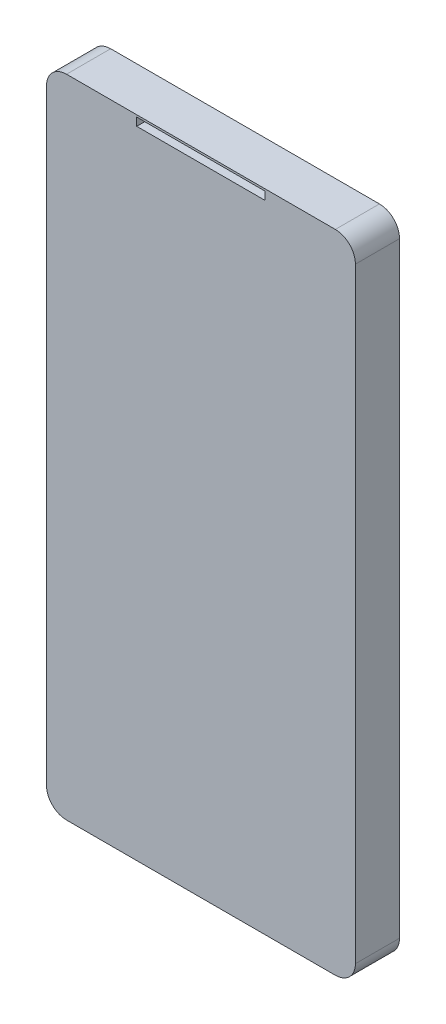
ISO-10303-21;
HEADER;
FILE_DESCRIPTION(('STEP AP214'),'2;1');
FILE_NAME('part.step','',(''),(''),'','','');
FILE_SCHEMA(('AUTOMOTIVE_DESIGN { 1 0 10303 214 1 1 1 1 }'));
ENDSEC;
DATA;
#1=APPLICATION_CONTEXT('core data for automotive mechanical design processes');
#2=APPLICATION_PROTOCOL_DEFINITION('international standard','automotive_design',2000,#1);
#3=PRODUCT_CONTEXT('',#1,'mechanical');
#4=PRODUCT('Part','Part','',(#3));
#5=PRODUCT_RELATED_PRODUCT_CATEGORY('part','',(#4));
#6=PRODUCT_DEFINITION_FORMATION('','',#4);
#7=PRODUCT_DEFINITION_CONTEXT('part definition',#1,'design');
#8=PRODUCT_DEFINITION('design','',#6,#7);
#9=PRODUCT_DEFINITION_SHAPE('','',#8);
#10=(LENGTH_UNIT() NAMED_UNIT(*) SI_UNIT(.MILLI.,.METRE.));
#11=(NAMED_UNIT(*) PLANE_ANGLE_UNIT() SI_UNIT($,.RADIAN.));
#12=(NAMED_UNIT(*) SI_UNIT($,.STERADIAN.) SOLID_ANGLE_UNIT());
#13=UNCERTAINTY_MEASURE_WITH_UNIT(LENGTH_MEASURE(1.E-05),#10,'distance_accuracy_value','');
#14=(GEOMETRIC_REPRESENTATION_CONTEXT(3) GLOBAL_UNCERTAINTY_ASSIGNED_CONTEXT((#13)) GLOBAL_UNIT_ASSIGNED_CONTEXT((#10,
#11,#12)) REPRESENTATION_CONTEXT('',''));
#15=CARTESIAN_POINT('',(0.,0.,0.));
#16=DIRECTION('',(0.,0.,1.));
#17=DIRECTION('',(1.,0.,0.));
#18=AXIS2_PLACEMENT_3D('',#15,#16,#17);
#19=CARTESIAN_POINT('',(0.,0.,0.));
#20=DIRECTION('',(0.,0.,1.));
#21=DIRECTION('',(1.,0.,0.));
#22=AXIS2_PLACEMENT_3D('',#19,#20,#21);
#23=PLANE('',#22);
#24=CARTESIAN_POINT('',(0.,0.,0.));
#25=DIRECTION('',(0.,0.,-1.));
#26=DIRECTION('',(1.,0.,0.));
#27=AXIS2_PLACEMENT_3D('',#24,#25,#26);
#28=CIRCLE('',#27,1.);
#29=CARTESIAN_POINT('',(1.,0.,0.));
#30=VERTEX_POINT('',#29);
#31=EDGE_CURVE('E523',#30,#30,#28,.T.);
#32=ORIENTED_EDGE('',*,*,#31,.F.);
#33=EDGE_LOOP('',(#32));
#34=FACE_BOUND('',#33,.T.);
#35=DIRECTION('',(0.,1.,0.));
#36=VECTOR('',#35,1.);
#37=CARTESIAN_POINT('',(38.5,80.5,0.));
#38=LINE('',#37,#36);
#39=CARTESIAN_POINT('',(38.5,-75.5,0.));
#40=VERTEX_POINT('',#39);
#41=CARTESIAN_POINT('',(38.5,75.5,0.));
#42=VERTEX_POINT('',#41);
#43=EDGE_CURVE('E553',#40,#42,#38,.T.);
#44=ORIENTED_EDGE('',*,*,#43,.F.);
#45=CARTESIAN_POINT('',(33.5,-75.5,0.));
#46=DIRECTION('',(0.,0.,1.));
#47=DIRECTION('',(1.,0.,0.));
#48=AXIS2_PLACEMENT_3D('',#45,#46,#47);
#49=CIRCLE('',#48,5.);
#50=CARTESIAN_POINT('',(33.5,-80.5,0.));
#51=VERTEX_POINT('',#50);
#52=EDGE_CURVE('E632',#40,#51,#49,.F.);
#53=ORIENTED_EDGE('',*,*,#52,.T.);
#54=DIRECTION('',(1.,0.,0.));
#55=VECTOR('',#54,1.);
#56=CARTESIAN_POINT('',(-38.5,-80.5,0.));
#57=LINE('',#56,#55);
#58=CARTESIAN_POINT('',(-33.5,-80.5,0.));
#59=VERTEX_POINT('',#58);
#60=EDGE_CURVE('E568',#59,#51,#57,.T.);
#61=ORIENTED_EDGE('',*,*,#60,.F.);
#62=CARTESIAN_POINT('',(-33.5,-75.5,0.));
#63=DIRECTION('',(0.,0.,1.));
#64=DIRECTION('',(1.,0.,0.));
#65=AXIS2_PLACEMENT_3D('',#62,#63,#64);
#66=CIRCLE('',#65,5.);
#67=CARTESIAN_POINT('',(-38.5,-75.5,0.));
#68=VERTEX_POINT('',#67);
#69=EDGE_CURVE('E630',#59,#68,#66,.F.);
#70=ORIENTED_EDGE('',*,*,#69,.T.);
#71=DIRECTION('',(0.,-1.,0.));
#72=VECTOR('',#71,1.);
#73=CARTESIAN_POINT('',(-38.5,80.5,0.));
#74=LINE('',#73,#72);
#75=CARTESIAN_POINT('',(-38.5,75.5,0.));
#76=VERTEX_POINT('',#75);
#77=EDGE_CURVE('E582',#76,#68,#74,.T.);
#78=ORIENTED_EDGE('',*,*,#77,.F.);
#79=CARTESIAN_POINT('',(-33.5,75.5,0.));
#80=DIRECTION('',(0.,0.,1.));
#81=DIRECTION('',(1.,0.,0.));
#82=AXIS2_PLACEMENT_3D('',#79,#80,#81);
#83=CIRCLE('',#82,5.);
#84=CARTESIAN_POINT('',(-33.5,80.5,0.));
#85=VERTEX_POINT('',#84);
#86=EDGE_CURVE('E628',#76,#85,#83,.F.);
#87=ORIENTED_EDGE('',*,*,#86,.T.);
#88=DIRECTION('',(-1.,0.,0.));
#89=VECTOR('',#88,1.);
#90=CARTESIAN_POINT('',(-38.5,80.5,0.));
#91=LINE('',#90,#89);
#92=CARTESIAN_POINT('',(33.5,80.5,0.));
#93=VERTEX_POINT('',#92);
#94=EDGE_CURVE('E579',#93,#85,#91,.T.);
#95=ORIENTED_EDGE('',*,*,#94,.F.);
#96=CARTESIAN_POINT('',(33.5,75.5,0.));
#97=DIRECTION('',(0.,0.,1.));
#98=DIRECTION('',(1.,0.,0.));
#99=AXIS2_PLACEMENT_3D('',#96,#97,#98);
#100=CIRCLE('',#99,5.);
#101=EDGE_CURVE('E626',#93,#42,#100,.F.);
#102=ORIENTED_EDGE('',*,*,#101,.T.);
#103=EDGE_LOOP('',(#44,#53,#61,#70,#78,#87,#95,#102));
#104=FACE_BOUND('',#103,.T.);
#105=DIRECTION('',(0.,-1.,0.));
#106=VECTOR('',#105,1.);
#107=CARTESIAN_POINT('',(31.5,76.5,0.));
#108=LINE('',#107,#106);
#109=CARTESIAN_POINT('',(31.5,71.5,0.));
#110=VERTEX_POINT('',#109);
#111=CARTESIAN_POINT('',(31.5,18.5,0.));
#112=VERTEX_POINT('',#111);
#113=EDGE_CURVE('E536',#110,#112,#108,.T.);
#114=ORIENTED_EDGE('',*,*,#113,.F.);
#115=CARTESIAN_POINT('',(26.5,71.5,0.));
#116=DIRECTION('',(0.,0.,1.));
#117=DIRECTION('',(1.,0.,0.));
#118=AXIS2_PLACEMENT_3D('',#115,#116,#117);
#119=CIRCLE('',#118,5.);
#120=CARTESIAN_POINT('',(26.5,76.5,0.));
#121=VERTEX_POINT('',#120);
#122=EDGE_CURVE('E617',#110,#121,#119,.T.);
#123=ORIENTED_EDGE('',*,*,#122,.T.);
#124=DIRECTION('',(1.,0.,0.));
#125=VECTOR('',#124,1.);
#126=CARTESIAN_POINT('',(31.5,76.5,0.));
#127=LINE('',#126,#125);
#128=CARTESIAN_POINT('',(3.49999999999999,76.5,0.));
#129=VERTEX_POINT('',#128);
#130=EDGE_CURVE('E544',#129,#121,#127,.T.);
#131=ORIENTED_EDGE('',*,*,#130,.F.);
#132=CARTESIAN_POINT('',(3.49999999999999,71.5,0.));
#133=DIRECTION('',(0.,0.,1.));
#134=DIRECTION('',(1.,0.,0.));
#135=AXIS2_PLACEMENT_3D('',#132,#133,#134);
#136=CIRCLE('',#135,5.);
#137=CARTESIAN_POINT('',(-1.50000000000001,71.5,0.));
#138=VERTEX_POINT('',#137);
#139=EDGE_CURVE('E619',#129,#138,#136,.T.);
#140=ORIENTED_EDGE('',*,*,#139,.T.);
#141=DIRECTION('',(0.,1.,0.));
#142=VECTOR('',#141,1.);
#143=CARTESIAN_POINT('',(-1.50000000000001,76.5,0.));
#144=LINE('',#143,#142);
#145=CARTESIAN_POINT('',(-1.50000000000001,18.5,0.));
#146=VERTEX_POINT('',#145);
#147=EDGE_CURVE('E559',#146,#138,#144,.T.);
#148=ORIENTED_EDGE('',*,*,#147,.F.);
#149=CARTESIAN_POINT('',(3.49999999999999,18.5,0.));
#150=DIRECTION('',(0.,0.,1.));
#151=DIRECTION('',(1.,0.,0.));
#152=AXIS2_PLACEMENT_3D('',#149,#150,#151);
#153=CIRCLE('',#152,5.);
#154=CARTESIAN_POINT('',(3.49999999999999,13.5,0.));
#155=VERTEX_POINT('',#154);
#156=EDGE_CURVE('E615',#146,#155,#153,.T.);
#157=ORIENTED_EDGE('',*,*,#156,.T.);
#158=DIRECTION('',(-1.,0.,0.));
#159=VECTOR('',#158,1.);
#160=CARTESIAN_POINT('',(31.5,13.5,0.));
#161=LINE('',#160,#159);
#162=CARTESIAN_POINT('',(26.5,13.5,0.));
#163=VERTEX_POINT('',#162);
#164=EDGE_CURVE('E556',#163,#155,#161,.T.);
#165=ORIENTED_EDGE('',*,*,#164,.F.);
#166=CARTESIAN_POINT('',(26.5,18.5,0.));
#167=DIRECTION('',(0.,0.,1.));
#168=DIRECTION('',(1.,0.,0.));
#169=AXIS2_PLACEMENT_3D('',#166,#167,#168);
#170=CIRCLE('',#169,5.);
#171=EDGE_CURVE('E613',#163,#112,#170,.T.);
#172=ORIENTED_EDGE('',*,*,#171,.T.);
#173=EDGE_LOOP('',(#114,#123,#131,#140,#148,#157,#165,#172));
#174=FACE_BOUND('',#173,.T.);
#175=ADVANCED_FACE('F359',(#34,#104,#174),#23,.F.);
#176=CARTESIAN_POINT('',(38.5,80.5,11.));
#177=DIRECTION('',(-1.,0.,0.));
#178=DIRECTION('',(0.,-1.,0.));
#179=AXIS2_PLACEMENT_3D('',#176,#177,#178);
#180=PLANE('',#179);
#181=DIRECTION('',(0.,1.,0.));
#182=VECTOR('',#181,1.);
#183=CARTESIAN_POINT('',(38.5,80.5,11.));
#184=LINE('',#183,#182);
#185=CARTESIAN_POINT('',(38.5,-75.5,11.));
#186=VERTEX_POINT('',#185);
#187=CARTESIAN_POINT('',(38.5,75.5,11.));
#188=VERTEX_POINT('',#187);
#189=EDGE_CURVE('E564',#186,#188,#184,.T.);
#190=ORIENTED_EDGE('',*,*,#189,.F.);
#191=DIRECTION('',(0.,0.,-1.));
#192=VECTOR('',#191,1.);
#193=CARTESIAN_POINT('',(38.5,-75.5,11.));
#194=LINE('',#193,#192);
#195=EDGE_CURVE('E623',#186,#40,#194,.T.);
#196=ORIENTED_EDGE('',*,*,#195,.T.);
#197=ORIENTED_EDGE('',*,*,#43,.T.);
#198=DIRECTION('',(0.,0.,-1.));
#199=VECTOR('',#198,1.);
#200=CARTESIAN_POINT('',(38.5,75.5,11.));
#201=LINE('',#200,#199);
#202=EDGE_CURVE('E621',#42,#188,#201,.F.);
#203=ORIENTED_EDGE('',*,*,#202,.T.);
#204=EDGE_LOOP('',(#190,#196,#197,#203));
#205=FACE_BOUND('',#204,.T.);
#206=ADVANCED_FACE('F685',(#205),#180,.F.);
#207=CARTESIAN_POINT('',(-38.5,80.5,11.));
#208=DIRECTION('',(0.,-1.,0.));
#209=DIRECTION('',(0.,0.,-1.));
#210=AXIS2_PLACEMENT_3D('',#207,#208,#209);
#211=PLANE('',#210);
#212=ORIENTED_EDGE('',*,*,#94,.T.);
#213=DIRECTION('',(0.,0.,-1.));
#214=VECTOR('',#213,1.);
#215=CARTESIAN_POINT('',(-33.5,80.5,11.));
#216=LINE('',#215,#214);
#217=CARTESIAN_POINT('',(-33.5,80.5,11.));
#218=VERTEX_POINT('',#217);
#219=EDGE_CURVE('E13',#85,#218,#216,.F.);
#220=ORIENTED_EDGE('',*,*,#219,.T.);
#221=DIRECTION('',(-1.,0.,0.));
#222=VECTOR('',#221,1.);
#223=CARTESIAN_POINT('',(-38.5,80.5,11.));
#224=LINE('',#223,#222);
#225=CARTESIAN_POINT('',(33.5,80.5,11.));
#226=VERTEX_POINT('',#225);
#227=EDGE_CURVE('E567',#226,#218,#224,.T.);
#228=ORIENTED_EDGE('',*,*,#227,.F.);
#229=DIRECTION('',(0.,0.,-1.));
#230=VECTOR('',#229,1.);
#231=CARTESIAN_POINT('',(33.5,80.5,11.));
#232=LINE('',#231,#230);
#233=EDGE_CURVE('E367',#226,#93,#232,.T.);
#234=ORIENTED_EDGE('',*,*,#233,.T.);
#235=EDGE_LOOP('',(#212,#220,#228,#234));
#236=FACE_BOUND('',#235,.T.);
#237=ADVANCED_FACE('F655',(#236),#211,.F.);
#238=CARTESIAN_POINT('',(-38.5,80.5,11.));
#239=DIRECTION('',(1.,0.,0.));
#240=DIRECTION('',(0.,1.,0.));
#241=AXIS2_PLACEMENT_3D('',#238,#239,#240);
#242=PLANE('',#241);
#243=ORIENTED_EDGE('',*,*,#77,.T.);
#244=DIRECTION('',(0.,0.,-1.));
#245=VECTOR('',#244,1.);
#246=CARTESIAN_POINT('',(-38.5,-75.5,11.));
#247=LINE('',#246,#245);
#248=CARTESIAN_POINT('',(-38.5,-75.5,11.));
#249=VERTEX_POINT('',#248);
#250=EDGE_CURVE('E382',#68,#249,#247,.F.);
#251=ORIENTED_EDGE('',*,*,#250,.T.);
#252=DIRECTION('',(0.,-1.,0.));
#253=VECTOR('',#252,1.);
#254=CARTESIAN_POINT('',(-38.5,80.5,11.));
#255=LINE('',#254,#253);
#256=CARTESIAN_POINT('',(-38.5,75.5,11.));
#257=VERTEX_POINT('',#256);
#258=EDGE_CURVE('E571',#257,#249,#255,.T.);
#259=ORIENTED_EDGE('',*,*,#258,.F.);
#260=DIRECTION('',(0.,0.,-1.));
#261=VECTOR('',#260,1.);
#262=CARTESIAN_POINT('',(-38.5,75.5,11.));
#263=LINE('',#262,#261);
#264=EDGE_CURVE('E647',#257,#76,#263,.T.);
#265=ORIENTED_EDGE('',*,*,#264,.T.);
#266=EDGE_LOOP('',(#243,#251,#259,#265));
#267=FACE_BOUND('',#266,.T.);
#268=ADVANCED_FACE('F667',(#267),#242,.F.);
#269=CARTESIAN_POINT('',(-38.5,-80.5,11.));
#270=DIRECTION('',(0.,1.,0.));
#271=DIRECTION('',(0.,0.,1.));
#272=AXIS2_PLACEMENT_3D('',#269,#270,#271);
#273=PLANE('',#272);
#274=ORIENTED_EDGE('',*,*,#60,.T.);
#275=DIRECTION('',(0.,0.,-1.));
#276=VECTOR('',#275,1.);
#277=CARTESIAN_POINT('',(33.5,-80.5,11.));
#278=LINE('',#277,#276);
#279=CARTESIAN_POINT('',(33.5,-80.5,11.));
#280=VERTEX_POINT('',#279);
#281=EDGE_CURVE('E637',#51,#280,#278,.F.);
#282=ORIENTED_EDGE('',*,*,#281,.T.);
#283=DIRECTION('',(1.,0.,0.));
#284=VECTOR('',#283,1.);
#285=CARTESIAN_POINT('',(-38.5,-80.5,11.));
#286=LINE('',#285,#284);
#287=CARTESIAN_POINT('',(-33.5,-80.5,11.));
#288=VERTEX_POINT('',#287);
#289=EDGE_CURVE('E573',#288,#280,#286,.T.);
#290=ORIENTED_EDGE('',*,*,#289,.F.);
#291=DIRECTION('',(0.,0.,-1.));
#292=VECTOR('',#291,1.);
#293=CARTESIAN_POINT('',(-33.5,-80.5,11.));
#294=LINE('',#293,#292);
#295=EDGE_CURVE('E634',#288,#59,#294,.T.);
#296=ORIENTED_EDGE('',*,*,#295,.T.);
#297=EDGE_LOOP('',(#274,#282,#290,#296));
#298=FACE_BOUND('',#297,.T.);
#299=ADVANCED_FACE('F677',(#298),#273,.F.);
#300=CARTESIAN_POINT('',(0.,0.,11.));
#301=DIRECTION('',(0.,0.,1.));
#302=DIRECTION('',(1.,0.,0.));
#303=AXIS2_PLACEMENT_3D('',#300,#301,#302);
#304=PLANE('',#303);
#305=DIRECTION('',(0.,-1.,0.));
#306=VECTOR('',#305,1.);
#307=CARTESIAN_POINT('',(-16.,80.,11.));
#308=LINE('',#307,#306);
#309=CARTESIAN_POINT('',(-16.,80.,11.));
#310=VERTEX_POINT('',#309);
#311=CARTESIAN_POINT('',(-16.,78.,11.));
#312=VERTEX_POINT('',#311);
#313=EDGE_CURVE('E374',#310,#312,#308,.T.);
#314=ORIENTED_EDGE('',*,*,#313,.F.);
#315=DIRECTION('',(-1.,0.,0.));
#316=VECTOR('',#315,1.);
#317=CARTESIAN_POINT('',(-16.,80.,11.));
#318=LINE('',#317,#316);
#319=CARTESIAN_POINT('',(16.,80.,11.));
#320=VERTEX_POINT('',#319);
#321=EDGE_CURVE('E517',#320,#310,#318,.T.);
#322=ORIENTED_EDGE('',*,*,#321,.F.);
#323=DIRECTION('',(0.,1.,0.));
#324=VECTOR('',#323,1.);
#325=CARTESIAN_POINT('',(16.,80.,11.));
#326=LINE('',#325,#324);
#327=CARTESIAN_POINT('',(16.,78.,11.));
#328=VERTEX_POINT('',#327);
#329=EDGE_CURVE('E520',#328,#320,#326,.T.);
#330=ORIENTED_EDGE('',*,*,#329,.F.);
#331=DIRECTION('',(1.,0.,0.));
#332=VECTOR('',#331,1.);
#333=CARTESIAN_POINT('',(-16.,78.,11.));
#334=LINE('',#333,#332);
#335=EDGE_CURVE('E529',#312,#328,#334,.T.);
#336=ORIENTED_EDGE('',*,*,#335,.F.);
#337=EDGE_LOOP('',(#314,#322,#330,#336));
#338=FACE_BOUND('',#337,.T.);
#339=ORIENTED_EDGE('',*,*,#289,.T.);
#340=CARTESIAN_POINT('',(33.5,-75.5,11.));
#341=DIRECTION('',(0.,0.,1.));
#342=DIRECTION('',(1.,0.,0.));
#343=AXIS2_PLACEMENT_3D('',#340,#341,#342);
#344=CIRCLE('',#343,5.);
#345=EDGE_CURVE('E645',#280,#186,#344,.T.);
#346=ORIENTED_EDGE('',*,*,#345,.T.);
#347=ORIENTED_EDGE('',*,*,#189,.T.);
#348=CARTESIAN_POINT('',(33.5,75.5,11.));
#349=DIRECTION('',(0.,0.,1.));
#350=DIRECTION('',(1.,0.,0.));
#351=AXIS2_PLACEMENT_3D('',#348,#349,#350);
#352=CIRCLE('',#351,5.);
#353=EDGE_CURVE('E639',#188,#226,#352,.T.);
#354=ORIENTED_EDGE('',*,*,#353,.T.);
#355=ORIENTED_EDGE('',*,*,#227,.T.);
#356=CARTESIAN_POINT('',(-33.5,75.5,11.));
#357=DIRECTION('',(0.,0.,1.));
#358=DIRECTION('',(1.,0.,0.));
#359=AXIS2_PLACEMENT_3D('',#356,#357,#358);
#360=CIRCLE('',#359,5.);
#361=EDGE_CURVE('E641',#218,#257,#360,.T.);
#362=ORIENTED_EDGE('',*,*,#361,.T.);
#363=ORIENTED_EDGE('',*,*,#258,.T.);
#364=CARTESIAN_POINT('',(-33.5,-75.5,11.));
#365=DIRECTION('',(0.,0.,1.));
#366=DIRECTION('',(1.,0.,0.));
#367=AXIS2_PLACEMENT_3D('',#364,#365,#366);
#368=CIRCLE('',#367,5.);
#369=EDGE_CURVE('E643',#249,#288,#368,.T.);
#370=ORIENTED_EDGE('',*,*,#369,.T.);
#371=EDGE_LOOP('',(#339,#346,#347,#354,#355,#362,#363,#370));
#372=FACE_BOUND('',#371,.T.);
#373=ADVANCED_FACE('F670',(#338,#372),#304,.T.);
#374=CARTESIAN_POINT('',(31.5,76.5,-2.1));
#375=DIRECTION('',(-1.,0.,0.));
#376=DIRECTION('',(0.,-1.,0.));
#377=AXIS2_PLACEMENT_3D('',#374,#375,#376);
#378=PLANE('',#377);
#379=ORIENTED_EDGE('',*,*,#113,.T.);
#380=DIRECTION('',(0.,0.,1.));
#381=VECTOR('',#380,1.);
#382=CARTESIAN_POINT('',(31.5,18.5,-2.1));
#383=LINE('',#382,#381);
#384=CARTESIAN_POINT('',(31.5,18.5,-2.1));
#385=VERTEX_POINT('',#384);
#386=EDGE_CURVE('E593',#112,#385,#383,.F.);
#387=ORIENTED_EDGE('',*,*,#386,.T.);
#388=DIRECTION('',(0.,-1.,0.));
#389=VECTOR('',#388,1.);
#390=CARTESIAN_POINT('',(31.5,76.5,-2.1));
#391=LINE('',#390,#389);
#392=CARTESIAN_POINT('',(31.5,71.5,-2.1));
#393=VERTEX_POINT('',#392);
#394=EDGE_CURVE('E540',#393,#385,#391,.T.);
#395=ORIENTED_EDGE('',*,*,#394,.F.);
#396=DIRECTION('',(0.,0.,1.));
#397=VECTOR('',#396,1.);
#398=CARTESIAN_POINT('',(31.5,71.5,-2.1));
#399=LINE('',#398,#397);
#400=EDGE_CURVE('E590',#393,#110,#399,.T.);
#401=ORIENTED_EDGE('',*,*,#400,.T.);
#402=EDGE_LOOP('',(#379,#387,#395,#401));
#403=FACE_BOUND('',#402,.T.);
#404=ADVANCED_FACE('F753',(#403),#378,.F.);
#405=CARTESIAN_POINT('',(31.5,13.5,-2.1));
#406=DIRECTION('',(0.,1.,0.));
#407=DIRECTION('',(0.,0.,1.));
#408=AXIS2_PLACEMENT_3D('',#405,#406,#407);
#409=PLANE('',#408);
#410=DIRECTION('',(-1.,0.,0.));
#411=VECTOR('',#410,1.);
#412=CARTESIAN_POINT('',(31.5,13.5,-2.1));
#413=LINE('',#412,#411);
#414=CARTESIAN_POINT('',(26.5,13.5,-2.1));
#415=VERTEX_POINT('',#414);
#416=CARTESIAN_POINT('',(3.49999999999999,13.5,-2.1));
#417=VERTEX_POINT('',#416);
#418=EDGE_CURVE('E543',#415,#417,#413,.T.);
#419=ORIENTED_EDGE('',*,*,#418,.F.);
#420=DIRECTION('',(0.,0.,1.));
#421=VECTOR('',#420,1.);
#422=CARTESIAN_POINT('',(26.5,13.5,-2.1));
#423=LINE('',#422,#421);
#424=EDGE_CURVE('E587',#415,#163,#423,.T.);
#425=ORIENTED_EDGE('',*,*,#424,.T.);
#426=ORIENTED_EDGE('',*,*,#164,.T.);
#427=DIRECTION('',(0.,0.,1.));
#428=VECTOR('',#427,1.);
#429=CARTESIAN_POINT('',(3.49999999999999,13.5,-2.1));
#430=LINE('',#429,#428);
#431=EDGE_CURVE('E576',#155,#417,#430,.F.);
#432=ORIENTED_EDGE('',*,*,#431,.T.);
#433=EDGE_LOOP('',(#419,#425,#426,#432));
#434=FACE_BOUND('',#433,.T.);
#435=ADVANCED_FACE('F836',(#434),#409,.F.);
#436=CARTESIAN_POINT('',(-1.50000000000001,76.5,-2.1));
#437=DIRECTION('',(1.,0.,0.));
#438=DIRECTION('',(0.,1.,0.));
#439=AXIS2_PLACEMENT_3D('',#436,#437,#438);
#440=PLANE('',#439);
#441=DIRECTION('',(0.,1.,0.));
#442=VECTOR('',#441,1.);
#443=CARTESIAN_POINT('',(-1.50000000000001,76.5,-2.1));
#444=LINE('',#443,#442);
#445=CARTESIAN_POINT('',(-1.50000000000001,18.5,-2.1));
#446=VERTEX_POINT('',#445);
#447=CARTESIAN_POINT('',(-1.50000000000001,71.5,-2.1));
#448=VERTEX_POINT('',#447);
#449=EDGE_CURVE('E547',#446,#448,#444,.T.);
#450=ORIENTED_EDGE('',*,*,#449,.F.);
#451=DIRECTION('',(0.,0.,1.));
#452=VECTOR('',#451,1.);
#453=CARTESIAN_POINT('',(-1.50000000000001,18.5,-2.1));
#454=LINE('',#453,#452);
#455=EDGE_CURVE('E605',#446,#146,#454,.T.);
#456=ORIENTED_EDGE('',*,*,#455,.T.);
#457=ORIENTED_EDGE('',*,*,#147,.T.);
#458=DIRECTION('',(0.,0.,1.));
#459=VECTOR('',#458,1.);
#460=CARTESIAN_POINT('',(-1.50000000000001,71.5,-2.1));
#461=LINE('',#460,#459);
#462=EDGE_CURVE('E603',#138,#448,#461,.F.);
#463=ORIENTED_EDGE('',*,*,#462,.T.);
#464=EDGE_LOOP('',(#450,#456,#457,#463));
#465=FACE_BOUND('',#464,.T.);
#466=ADVANCED_FACE('F832',(#465),#440,.F.);
#467=CARTESIAN_POINT('',(31.5,76.5,-2.1));
#468=DIRECTION('',(0.,-1.,0.));
#469=DIRECTION('',(0.,0.,-1.));
#470=AXIS2_PLACEMENT_3D('',#467,#468,#469);
#471=PLANE('',#470);
#472=ORIENTED_EDGE('',*,*,#130,.T.);
#473=DIRECTION('',(0.,0.,1.));
#474=VECTOR('',#473,1.);
#475=CARTESIAN_POINT('',(26.5,76.5,-2.1));
#476=LINE('',#475,#474);
#477=CARTESIAN_POINT('',(26.5,76.5,-2.1));
#478=VERTEX_POINT('',#477);
#479=EDGE_CURVE('E611',#121,#478,#476,.F.);
#480=ORIENTED_EDGE('',*,*,#479,.T.);
#481=DIRECTION('',(1.,0.,0.));
#482=VECTOR('',#481,1.);
#483=CARTESIAN_POINT('',(31.5,76.5,-2.1));
#484=LINE('',#483,#482);
#485=CARTESIAN_POINT('',(3.49999999999999,76.5,-2.1));
#486=VERTEX_POINT('',#485);
#487=EDGE_CURVE('E550',#486,#478,#484,.T.);
#488=ORIENTED_EDGE('',*,*,#487,.F.);
#489=DIRECTION('',(0.,0.,1.));
#490=VECTOR('',#489,1.);
#491=CARTESIAN_POINT('',(3.49999999999999,76.5,-2.1));
#492=LINE('',#491,#490);
#493=EDGE_CURVE('E608',#486,#129,#492,.T.);
#494=ORIENTED_EDGE('',*,*,#493,.T.);
#495=EDGE_LOOP('',(#472,#480,#488,#494));
#496=FACE_BOUND('',#495,.T.);
#497=ADVANCED_FACE('F828',(#496),#471,.F.);
#498=CARTESIAN_POINT('',(0.,0.,-2.1));
#499=DIRECTION('',(0.,0.,-1.));
#500=DIRECTION('',(-1.,0.,0.));
#501=AXIS2_PLACEMENT_3D('',#498,#499,#500);
#502=PLANE('',#501);
#503=ORIENTED_EDGE('',*,*,#394,.T.);
#504=CARTESIAN_POINT('',(26.5,18.5,-2.1));
#505=DIRECTION('',(0.,0.,-1.));
#506=DIRECTION('',(-1.,0.,0.));
#507=AXIS2_PLACEMENT_3D('',#504,#505,#506);
#508=CIRCLE('',#507,5.);
#509=EDGE_CURVE('E601',#385,#415,#508,.T.);
#510=ORIENTED_EDGE('',*,*,#509,.T.);
#511=ORIENTED_EDGE('',*,*,#418,.T.);
#512=CARTESIAN_POINT('',(3.49999999999999,18.5,-2.1));
#513=DIRECTION('',(0.,0.,-1.));
#514=DIRECTION('',(-1.,0.,0.));
#515=AXIS2_PLACEMENT_3D('',#512,#513,#514);
#516=CIRCLE('',#515,5.);
#517=EDGE_CURVE('E599',#417,#446,#516,.T.);
#518=ORIENTED_EDGE('',*,*,#517,.T.);
#519=ORIENTED_EDGE('',*,*,#449,.T.);
#520=CARTESIAN_POINT('',(3.49999999999999,71.5,-2.1));
#521=DIRECTION('',(0.,0.,-1.));
#522=DIRECTION('',(-1.,0.,0.));
#523=AXIS2_PLACEMENT_3D('',#520,#521,#522);
#524=CIRCLE('',#523,5.);
#525=EDGE_CURVE('E595',#448,#486,#524,.T.);
#526=ORIENTED_EDGE('',*,*,#525,.T.);
#527=ORIENTED_EDGE('',*,*,#487,.T.);
#528=CARTESIAN_POINT('',(26.5,71.5,-2.1));
#529=DIRECTION('',(0.,0.,-1.));
#530=DIRECTION('',(-1.,0.,0.));
#531=AXIS2_PLACEMENT_3D('',#528,#529,#530);
#532=CIRCLE('',#531,5.);
#533=EDGE_CURVE('E597',#478,#393,#532,.T.);
#534=ORIENTED_EDGE('',*,*,#533,.T.);
#535=EDGE_LOOP('',(#503,#510,#511,#518,#519,#526,#527,#534));
#536=FACE_BOUND('',#535,.T.);
#537=ADVANCED_FACE('F715',(#536),#502,.T.);
#538=CARTESIAN_POINT('',(26.5,18.5,-2.1));
#539=DIRECTION('',(0.,0.,1.));
#540=DIRECTION('',(1.,0.,0.));
#541=AXIS2_PLACEMENT_3D('',#538,#539,#540);
#542=CYLINDRICAL_SURFACE('',#541,5.);
#543=ORIENTED_EDGE('',*,*,#509,.F.);
#544=ORIENTED_EDGE('',*,*,#386,.F.);
#545=ORIENTED_EDGE('',*,*,#171,.F.);
#546=ORIENTED_EDGE('',*,*,#424,.F.);
#547=EDGE_LOOP('',(#543,#544,#545,#546));
#548=FACE_BOUND('',#547,.T.);
#549=ADVANCED_FACE('F711',(#548),#542,.T.);
#550=CARTESIAN_POINT('',(3.49999999999999,18.5,-2.1));
#551=DIRECTION('',(0.,0.,1.));
#552=DIRECTION('',(1.,0.,0.));
#553=AXIS2_PLACEMENT_3D('',#550,#551,#552);
#554=CYLINDRICAL_SURFACE('',#553,5.);
#555=ORIENTED_EDGE('',*,*,#517,.F.);
#556=ORIENTED_EDGE('',*,*,#431,.F.);
#557=ORIENTED_EDGE('',*,*,#156,.F.);
#558=ORIENTED_EDGE('',*,*,#455,.F.);
#559=EDGE_LOOP('',(#555,#556,#557,#558));
#560=FACE_BOUND('',#559,.T.);
#561=ADVANCED_FACE('F714',(#560),#554,.T.);
#562=CARTESIAN_POINT('',(26.5,71.5,-2.1));
#563=DIRECTION('',(0.,0.,1.));
#564=DIRECTION('',(1.,0.,0.));
#565=AXIS2_PLACEMENT_3D('',#562,#563,#564);
#566=CYLINDRICAL_SURFACE('',#565,5.);
#567=ORIENTED_EDGE('',*,*,#533,.F.);
#568=ORIENTED_EDGE('',*,*,#479,.F.);
#569=ORIENTED_EDGE('',*,*,#122,.F.);
#570=ORIENTED_EDGE('',*,*,#400,.F.);
#571=EDGE_LOOP('',(#567,#568,#569,#570));
#572=FACE_BOUND('',#571,.T.);
#573=ADVANCED_FACE('F719',(#572),#566,.T.);
#574=CARTESIAN_POINT('',(3.49999999999999,71.5,-2.1));
#575=DIRECTION('',(0.,0.,1.));
#576=DIRECTION('',(1.,0.,0.));
#577=AXIS2_PLACEMENT_3D('',#574,#575,#576);
#578=CYLINDRICAL_SURFACE('',#577,5.);
#579=ORIENTED_EDGE('',*,*,#525,.F.);
#580=ORIENTED_EDGE('',*,*,#462,.F.);
#581=ORIENTED_EDGE('',*,*,#139,.F.);
#582=ORIENTED_EDGE('',*,*,#493,.F.);
#583=EDGE_LOOP('',(#579,#580,#581,#582));
#584=FACE_BOUND('',#583,.T.);
#585=ADVANCED_FACE('F723',(#584),#578,.T.);
#586=CARTESIAN_POINT('',(33.5,-75.5,11.));
#587=DIRECTION('',(0.,0.,-1.));
#588=DIRECTION('',(-1.,0.,0.));
#589=AXIS2_PLACEMENT_3D('',#586,#587,#588);
#590=CYLINDRICAL_SURFACE('',#589,5.);
#591=ORIENTED_EDGE('',*,*,#345,.F.);
#592=ORIENTED_EDGE('',*,*,#281,.F.);
#593=ORIENTED_EDGE('',*,*,#52,.F.);
#594=ORIENTED_EDGE('',*,*,#195,.F.);
#595=EDGE_LOOP('',(#591,#592,#593,#594));
#596=FACE_BOUND('',#595,.T.);
#597=ADVANCED_FACE('F682',(#596),#590,.T.);
#598=CARTESIAN_POINT('',(-33.5,-75.5,11.));
#599=DIRECTION('',(0.,0.,-1.));
#600=DIRECTION('',(-1.,0.,0.));
#601=AXIS2_PLACEMENT_3D('',#598,#599,#600);
#602=CYLINDRICAL_SURFACE('',#601,5.);
#603=ORIENTED_EDGE('',*,*,#369,.F.);
#604=ORIENTED_EDGE('',*,*,#250,.F.);
#605=ORIENTED_EDGE('',*,*,#69,.F.);
#606=ORIENTED_EDGE('',*,*,#295,.F.);
#607=EDGE_LOOP('',(#603,#604,#605,#606));
#608=FACE_BOUND('',#607,.T.);
#609=ADVANCED_FACE('F674',(#608),#602,.T.);
#610=CARTESIAN_POINT('',(-33.5,75.5,11.));
#611=DIRECTION('',(0.,0.,-1.));
#612=DIRECTION('',(-1.,0.,0.));
#613=AXIS2_PLACEMENT_3D('',#610,#611,#612);
#614=CYLINDRICAL_SURFACE('',#613,5.);
#615=ORIENTED_EDGE('',*,*,#361,.F.);
#616=ORIENTED_EDGE('',*,*,#219,.F.);
#617=ORIENTED_EDGE('',*,*,#86,.F.);
#618=ORIENTED_EDGE('',*,*,#264,.F.);
#619=EDGE_LOOP('',(#615,#616,#617,#618));
#620=FACE_BOUND('',#619,.T.);
#621=ADVANCED_FACE('F666',(#620),#614,.T.);
#622=CARTESIAN_POINT('',(33.5,75.5,11.));
#623=DIRECTION('',(0.,0.,-1.));
#624=DIRECTION('',(-1.,0.,0.));
#625=AXIS2_PLACEMENT_3D('',#622,#623,#624);
#626=CYLINDRICAL_SURFACE('',#625,5.);
#627=ORIENTED_EDGE('',*,*,#353,.F.);
#628=ORIENTED_EDGE('',*,*,#202,.F.);
#629=ORIENTED_EDGE('',*,*,#101,.F.);
#630=ORIENTED_EDGE('',*,*,#233,.F.);
#631=EDGE_LOOP('',(#627,#628,#629,#630));
#632=FACE_BOUND('',#631,.T.);
#633=ADVANCED_FACE('F361',(#632),#626,.T.);
#634=CARTESIAN_POINT('',(-16.,80.,9.));
#635=DIRECTION('',(-1.,0.,0.));
#636=DIRECTION('',(0.,0.,1.));
#637=AXIS2_PLACEMENT_3D('',#634,#635,#636);
#638=PLANE('',#637);
#639=ORIENTED_EDGE('',*,*,#313,.T.);
#640=DIRECTION('',(0.,0.,1.));
#641=VECTOR('',#640,1.);
#642=CARTESIAN_POINT('',(-16.,78.,9.));
#643=LINE('',#642,#641);
#644=CARTESIAN_POINT('',(-16.,78.,9.));
#645=VERTEX_POINT('',#644);
#646=EDGE_CURVE('E495',#645,#312,#643,.T.);
#647=ORIENTED_EDGE('',*,*,#646,.F.);
#648=DIRECTION('',(0.,-1.,0.));
#649=VECTOR('',#648,1.);
#650=CARTESIAN_POINT('',(-16.,80.,9.));
#651=LINE('',#650,#649);
#652=CARTESIAN_POINT('',(-16.,80.,9.));
#653=VERTEX_POINT('',#652);
#654=EDGE_CURVE('E499',#653,#645,#651,.T.);
#655=ORIENTED_EDGE('',*,*,#654,.F.);
#656=DIRECTION('',(0.,0.,1.));
#657=VECTOR('',#656,1.);
#658=CARTESIAN_POINT('',(-16.,80.,9.));
#659=LINE('',#658,#657);
#660=EDGE_CURVE('E534',#653,#310,#659,.T.);
#661=ORIENTED_EDGE('',*,*,#660,.T.);
#662=EDGE_LOOP('',(#639,#647,#655,#661));
#663=FACE_BOUND('',#662,.T.);
#664=ADVANCED_FACE('F497',(#663),#638,.F.);
#665=CARTESIAN_POINT('',(-16.,80.,9.));
#666=DIRECTION('',(0.,1.,0.));
#667=DIRECTION('',(0.,0.,1.));
#668=AXIS2_PLACEMENT_3D('',#665,#666,#667);
#669=PLANE('',#668);
#670=ORIENTED_EDGE('',*,*,#321,.T.);
#671=ORIENTED_EDGE('',*,*,#660,.F.);
#672=DIRECTION('',(-1.,0.,0.));
#673=VECTOR('',#672,1.);
#674=CARTESIAN_POINT('',(-16.,80.,9.));
#675=LINE('',#674,#673);
#676=CARTESIAN_POINT('',(16.,80.,9.));
#677=VERTEX_POINT('',#676);
#678=EDGE_CURVE('E505',#677,#653,#675,.T.);
#679=ORIENTED_EDGE('',*,*,#678,.F.);
#680=DIRECTION('',(0.,0.,1.));
#681=VECTOR('',#680,1.);
#682=CARTESIAN_POINT('',(16.,80.,9.));
#683=LINE('',#682,#681);
#684=EDGE_CURVE('E537',#677,#320,#683,.T.);
#685=ORIENTED_EDGE('',*,*,#684,.T.);
#686=EDGE_LOOP('',(#670,#671,#679,#685));
#687=FACE_BOUND('',#686,.T.);
#688=ADVANCED_FACE('F692',(#687),#669,.F.);
#689=CARTESIAN_POINT('',(16.,80.,9.));
#690=DIRECTION('',(1.,0.,0.));
#691=DIRECTION('',(0.,0.,-1.));
#692=AXIS2_PLACEMENT_3D('',#689,#690,#691);
#693=PLANE('',#692);
#694=ORIENTED_EDGE('',*,*,#329,.T.);
#695=ORIENTED_EDGE('',*,*,#684,.F.);
#696=DIRECTION('',(0.,1.,0.));
#697=VECTOR('',#696,1.);
#698=CARTESIAN_POINT('',(16.,80.,9.));
#699=LINE('',#698,#697);
#700=CARTESIAN_POINT('',(16.,78.,9.));
#701=VERTEX_POINT('',#700);
#702=EDGE_CURVE('E513',#701,#677,#699,.T.);
#703=ORIENTED_EDGE('',*,*,#702,.F.);
#704=DIRECTION('',(0.,0.,1.));
#705=VECTOR('',#704,1.);
#706=CARTESIAN_POINT('',(16.,78.,9.));
#707=LINE('',#706,#705);
#708=EDGE_CURVE('E504',#701,#328,#707,.T.);
#709=ORIENTED_EDGE('',*,*,#708,.T.);
#710=EDGE_LOOP('',(#694,#695,#703,#709));
#711=FACE_BOUND('',#710,.T.);
#712=ADVANCED_FACE('F770',(#711),#693,.F.);
#713=CARTESIAN_POINT('',(-16.,78.,9.));
#714=DIRECTION('',(0.,-1.,0.));
#715=DIRECTION('',(0.,0.,-1.));
#716=AXIS2_PLACEMENT_3D('',#713,#714,#715);
#717=PLANE('',#716);
#718=ORIENTED_EDGE('',*,*,#335,.T.);
#719=ORIENTED_EDGE('',*,*,#708,.F.);
#720=DIRECTION('',(1.,0.,0.));
#721=VECTOR('',#720,1.);
#722=CARTESIAN_POINT('',(-16.,78.,9.));
#723=LINE('',#722,#721);
#724=EDGE_CURVE('E508',#645,#701,#723,.T.);
#725=ORIENTED_EDGE('',*,*,#724,.F.);
#726=ORIENTED_EDGE('',*,*,#646,.T.);
#727=EDGE_LOOP('',(#718,#719,#725,#726));
#728=FACE_BOUND('',#727,.T.);
#729=ADVANCED_FACE('F509',(#728),#717,.F.);
#730=CARTESIAN_POINT('',(0.,0.,9.));
#731=DIRECTION('',(0.,0.,1.));
#732=DIRECTION('',(1.,0.,0.));
#733=AXIS2_PLACEMENT_3D('',#730,#731,#732);
#734=PLANE('',#733);
#735=ORIENTED_EDGE('',*,*,#654,.T.);
#736=ORIENTED_EDGE('',*,*,#724,.T.);
#737=ORIENTED_EDGE('',*,*,#702,.T.);
#738=ORIENTED_EDGE('',*,*,#678,.T.);
#739=EDGE_LOOP('',(#735,#736,#737,#738));
#740=FACE_BOUND('',#739,.T.);
#741=ADVANCED_FACE('F515',(#740),#734,.T.);
#742=CARTESIAN_POINT('',(0.,0.,0.));
#743=DIRECTION('',(0.,0.,1.));
#744=DIRECTION('',(1.,0.,0.));
#745=AXIS2_PLACEMENT_3D('',#742,#743,#744);
#746=CYLINDRICAL_SURFACE('',#745,1.);
#747=CARTESIAN_POINT('',(0.,0.,-0.01));
#748=DIRECTION('',(0.,0.,-1.));
#749=DIRECTION('',(-1.,0.,0.));
#750=AXIS2_PLACEMENT_3D('',#747,#748,#749);
#751=CIRCLE('',#750,1.);
#752=CARTESIAN_POINT('',(-1.,0.,-0.01));
#753=VERTEX_POINT('',#752);
#754=EDGE_CURVE('E530',#753,#753,#751,.T.);
#755=ORIENTED_EDGE('',*,*,#754,.F.);
#756=EDGE_LOOP('',(#755));
#757=FACE_BOUND('',#756,.T.);
#758=ORIENTED_EDGE('',*,*,#31,.T.);
#759=EDGE_LOOP('',(#758));
#760=FACE_BOUND('',#759,.T.);
#761=ADVANCED_FACE('F796',(#757,#760),#746,.T.);
#762=CARTESIAN_POINT('',(0.,0.,-0.01));
#763=DIRECTION('',(0.,0.,1.));
#764=DIRECTION('',(1.,0.,0.));
#765=AXIS2_PLACEMENT_3D('',#762,#763,#764);
#766=PLANE('',#765);
#767=ORIENTED_EDGE('',*,*,#754,.T.);
#768=EDGE_LOOP('',(#767));
#769=FACE_BOUND('',#768,.T.);
#770=ADVANCED_FACE('F810',(#769),#766,.F.);
#771=CLOSED_SHELL('',(#175,#206,#237,#268,#299,#373,#404,#435,#466,#497,#537,#549,#561,#573,
#585,#597,#609,#621,#633,#664,#688,#712,#729,#741,#761,#770));
#772=MANIFOLD_SOLID_BREP('B2',#771);
#773=ADVANCED_BREP_SHAPE_REPRESENTATION('',(#18,#772),#14);
#774=SHAPE_DEFINITION_REPRESENTATION(#9,#773);
ENDSEC;
END-ISO-10303-21;
